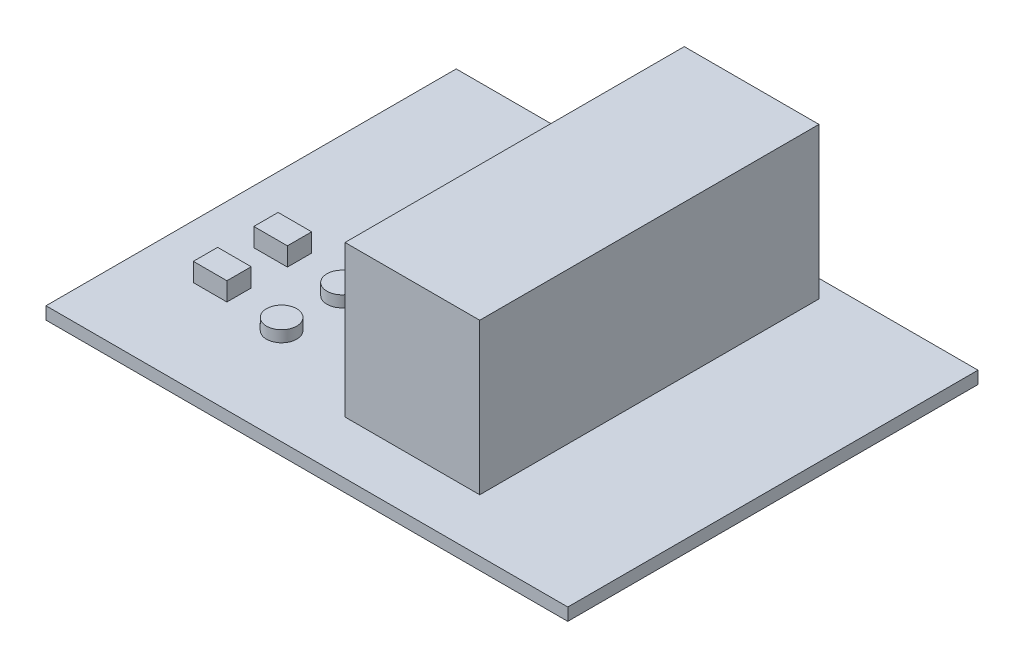
ISO-10303-21;
HEADER;
FILE_DESCRIPTION(('STEP AP214'),'2;1');
FILE_NAME('part.step','',(''),(''),'','','');
FILE_SCHEMA(('AUTOMOTIVE_DESIGN { 1 0 10303 214 1 1 1 1 }'));
ENDSEC;
DATA;
#1=APPLICATION_CONTEXT('core data for automotive mechanical design processes');
#2=APPLICATION_PROTOCOL_DEFINITION('international standard','automotive_design',2000,#1);
#3=PRODUCT_CONTEXT('',#1,'mechanical');
#4=PRODUCT('Part','Part','',(#3));
#5=PRODUCT_RELATED_PRODUCT_CATEGORY('part','',(#4));
#6=PRODUCT_DEFINITION_FORMATION('','',#4);
#7=PRODUCT_DEFINITION_CONTEXT('part definition',#1,'design');
#8=PRODUCT_DEFINITION('design','',#6,#7);
#9=PRODUCT_DEFINITION_SHAPE('','',#8);
#10=(LENGTH_UNIT() NAMED_UNIT(*) SI_UNIT(.MILLI.,.METRE.));
#11=(NAMED_UNIT(*) PLANE_ANGLE_UNIT() SI_UNIT($,.RADIAN.));
#12=(NAMED_UNIT(*) SI_UNIT($,.STERADIAN.) SOLID_ANGLE_UNIT());
#13=UNCERTAINTY_MEASURE_WITH_UNIT(LENGTH_MEASURE(1.E-05),#10,'distance_accuracy_value','');
#14=(GEOMETRIC_REPRESENTATION_CONTEXT(3) GLOBAL_UNCERTAINTY_ASSIGNED_CONTEXT((#13)) GLOBAL_UNIT_ASSIGNED_CONTEXT((#10,
#11,#12)) REPRESENTATION_CONTEXT('',''));
#15=CARTESIAN_POINT('',(0.,0.,0.));
#16=DIRECTION('',(0.,0.,1.));
#17=DIRECTION('',(1.,0.,0.));
#18=AXIS2_PLACEMENT_3D('',#15,#16,#17);
#19=CARTESIAN_POINT('',(0.,1.65,0.));
#20=DIRECTION('',(0.,-1.,0.));
#21=DIRECTION('',(0.,0.,-1.));
#22=AXIS2_PLACEMENT_3D('',#19,#20,#21);
#23=PLANE('',#22);
#24=DIRECTION('',(0.,0.,-1.));
#25=VECTOR('',#24,1.);
#26=CARTESIAN_POINT('',(-22.975,1.65,3.53));
#27=LINE('',#26,#25);
#28=CARTESIAN_POINT('',(-22.975,1.65,6.74));
#29=VERTEX_POINT('',#28);
#30=CARTESIAN_POINT('',(-22.975,1.65,3.53));
#31=VERTEX_POINT('',#30);
#32=EDGE_CURVE('E168',#29,#31,#27,.T.);
#33=ORIENTED_EDGE('',*,*,#32,.F.);
#34=DIRECTION('',(1.,0.,0.));
#35=VECTOR('',#34,1.);
#36=CARTESIAN_POINT('',(-27.415,1.65,6.74));
#37=LINE('',#36,#35);
#38=CARTESIAN_POINT('',(-27.415,1.65,6.74));
#39=VERTEX_POINT('',#38);
#40=EDGE_CURVE('E181',#39,#29,#37,.T.);
#41=ORIENTED_EDGE('',*,*,#40,.F.);
#42=DIRECTION('',(0.,0.,1.));
#43=VECTOR('',#42,1.);
#44=CARTESIAN_POINT('',(-27.415,1.65,3.53));
#45=LINE('',#44,#43);
#46=CARTESIAN_POINT('',(-27.415,1.65,3.53));
#47=VERTEX_POINT('',#46);
#48=EDGE_CURVE('E190',#47,#39,#45,.T.);
#49=ORIENTED_EDGE('',*,*,#48,.F.);
#50=DIRECTION('',(-1.,0.,0.));
#51=VECTOR('',#50,1.);
#52=CARTESIAN_POINT('',(-27.415,1.65,3.53));
#53=LINE('',#52,#51);
#54=EDGE_CURVE('E171',#31,#47,#53,.T.);
#55=ORIENTED_EDGE('',*,*,#54,.F.);
#56=EDGE_LOOP('',(#33,#41,#49,#55));
#57=FACE_BOUND('',#56,.T.);
#58=DIRECTION('',(0.,0.,-1.));
#59=VECTOR('',#58,1.);
#60=CARTESIAN_POINT('',(34.515,1.65,27.135));
#61=LINE('',#60,#59);
#62=CARTESIAN_POINT('',(34.515,1.65,27.135));
#63=VERTEX_POINT('',#62);
#64=CARTESIAN_POINT('',(34.515,1.65,-27.135));
#65=VERTEX_POINT('',#64);
#66=EDGE_CURVE('E246',#63,#65,#61,.T.);
#67=ORIENTED_EDGE('',*,*,#66,.T.);
#68=DIRECTION('',(-1.,0.,0.));
#69=VECTOR('',#68,1.);
#70=CARTESIAN_POINT('',(-34.515,1.65,-27.135));
#71=LINE('',#70,#69);
#72=CARTESIAN_POINT('',(-34.515,1.65,-27.135));
#73=VERTEX_POINT('',#72);
#74=EDGE_CURVE('E249',#65,#73,#71,.T.);
#75=ORIENTED_EDGE('',*,*,#74,.T.);
#76=DIRECTION('',(0.,0.,1.));
#77=VECTOR('',#76,1.);
#78=CARTESIAN_POINT('',(-34.515,1.65,27.135));
#79=LINE('',#78,#77);
#80=CARTESIAN_POINT('',(-34.515,1.65,27.135));
#81=VERTEX_POINT('',#80);
#82=EDGE_CURVE('E252',#73,#81,#79,.T.);
#83=ORIENTED_EDGE('',*,*,#82,.T.);
#84=DIRECTION('',(1.,0.,0.));
#85=VECTOR('',#84,1.);
#86=CARTESIAN_POINT('',(-34.515,1.65,27.135));
#87=LINE('',#86,#85);
#88=EDGE_CURVE('E254',#81,#63,#87,.T.);
#89=ORIENTED_EDGE('',*,*,#88,.T.);
#90=EDGE_LOOP('',(#67,#75,#83,#89));
#91=FACE_BOUND('',#90,.T.);
#92=CARTESIAN_POINT('',(-16.095,1.65,14.385));
#93=DIRECTION('',(0.,-1.,0.));
#94=DIRECTION('',(0.,0.,-1.));
#95=AXIS2_PLACEMENT_3D('',#92,#93,#94);
#96=CIRCLE('',#95,2.);
#97=CARTESIAN_POINT('',(-16.095,1.65,12.385));
#98=VERTEX_POINT('',#97);
#99=EDGE_CURVE('E42',#98,#98,#96,.F.);
#100=ORIENTED_EDGE('',*,*,#99,.F.);
#101=EDGE_LOOP('',(#100));
#102=FACE_BOUND('',#101,.T.);
#103=CARTESIAN_POINT('',(-16.095,1.65,6.385));
#104=DIRECTION('',(0.,-1.,0.));
#105=DIRECTION('',(0.,0.,-1.));
#106=AXIS2_PLACEMENT_3D('',#103,#104,#105);
#107=CIRCLE('',#106,2.);
#108=CARTESIAN_POINT('',(-16.095,1.65,4.385));
#109=VERTEX_POINT('',#108);
#110=EDGE_CURVE('E11',#109,#109,#107,.F.);
#111=ORIENTED_EDGE('',*,*,#110,.F.);
#112=EDGE_LOOP('',(#111));
#113=FACE_BOUND('',#112,.T.);
#114=DIRECTION('',(0.,0.,-1.));
#115=VECTOR('',#114,1.);
#116=CARTESIAN_POINT('',(-22.975,1.65,11.53));
#117=LINE('',#116,#115);
#118=CARTESIAN_POINT('',(-22.975,1.65,14.74));
#119=VERTEX_POINT('',#118);
#120=CARTESIAN_POINT('',(-22.975,1.65,11.53));
#121=VERTEX_POINT('',#120);
#122=EDGE_CURVE('E206',#119,#121,#117,.T.);
#123=ORIENTED_EDGE('',*,*,#122,.F.);
#124=DIRECTION('',(1.,0.,0.));
#125=VECTOR('',#124,1.);
#126=CARTESIAN_POINT('',(-27.415,1.65,14.74));
#127=LINE('',#126,#125);
#128=CARTESIAN_POINT('',(-27.415,1.65,14.74));
#129=VERTEX_POINT('',#128);
#130=EDGE_CURVE('E211',#129,#119,#127,.T.);
#131=ORIENTED_EDGE('',*,*,#130,.F.);
#132=DIRECTION('',(0.,0.,1.));
#133=VECTOR('',#132,1.);
#134=CARTESIAN_POINT('',(-27.415,1.65,11.53));
#135=LINE('',#134,#133);
#136=CARTESIAN_POINT('',(-27.415,1.65,11.53));
#137=VERTEX_POINT('',#136);
#138=EDGE_CURVE('E223',#137,#129,#135,.T.);
#139=ORIENTED_EDGE('',*,*,#138,.F.);
#140=DIRECTION('',(-1.,0.,0.));
#141=VECTOR('',#140,1.);
#142=CARTESIAN_POINT('',(-27.415,1.65,11.53));
#143=LINE('',#142,#141);
#144=EDGE_CURVE('E220',#121,#137,#143,.T.);
#145=ORIENTED_EDGE('',*,*,#144,.F.);
#146=EDGE_LOOP('',(#123,#131,#139,#145));
#147=FACE_BOUND('',#146,.T.);
#148=DIRECTION('',(0.,0.,1.));
#149=VECTOR('',#148,1.);
#150=CARTESIAN_POINT('',(-1.98499999999999,1.65,-24.775));
#151=LINE('',#150,#149);
#152=CARTESIAN_POINT('',(-1.98499999999999,1.65,-24.775));
#153=VERTEX_POINT('',#152);
#154=CARTESIAN_POINT('',(-1.98499999999999,1.65,20.105));
#155=VERTEX_POINT('',#154);
#156=EDGE_CURVE('E167',#153,#155,#151,.T.);
#157=ORIENTED_EDGE('',*,*,#156,.F.);
#158=DIRECTION('',(-1.,0.,0.));
#159=VECTOR('',#158,1.);
#160=CARTESIAN_POINT('',(-1.98499999999999,1.65,-24.775));
#161=LINE('',#160,#159);
#162=CARTESIAN_POINT('',(15.835,1.65,-24.775));
#163=VERTEX_POINT('',#162);
#164=EDGE_CURVE('E164',#163,#153,#161,.T.);
#165=ORIENTED_EDGE('',*,*,#164,.F.);
#166=DIRECTION('',(0.,0.,-1.));
#167=VECTOR('',#166,1.);
#168=CARTESIAN_POINT('',(15.835,1.65,-24.775));
#169=LINE('',#168,#167);
#170=CARTESIAN_POINT('',(15.835,1.65,20.105));
#171=VERTEX_POINT('',#170);
#172=EDGE_CURVE('E54',#171,#163,#169,.T.);
#173=ORIENTED_EDGE('',*,*,#172,.F.);
#174=DIRECTION('',(1.,0.,0.));
#175=VECTOR('',#174,1.);
#176=CARTESIAN_POINT('',(-1.98499999999999,1.65,20.105));
#177=LINE('',#176,#175);
#178=EDGE_CURVE('E49',#155,#171,#177,.T.);
#179=ORIENTED_EDGE('',*,*,#178,.F.);
#180=EDGE_LOOP('',(#157,#165,#173,#179));
#181=FACE_BOUND('',#180,.T.);
#182=ADVANCED_FACE('F34',(#57,#91,#102,#113,#147,#181),#23,.F.);
#183=CARTESIAN_POINT('',(34.515,1.65,27.135));
#184=DIRECTION('',(-1.,0.,0.));
#185=DIRECTION('',(0.,0.,1.));
#186=AXIS2_PLACEMENT_3D('',#183,#184,#185);
#187=PLANE('',#186);
#188=DIRECTION('',(0.,0.,-1.));
#189=VECTOR('',#188,1.);
#190=CARTESIAN_POINT('',(34.515,0.,27.135));
#191=LINE('',#190,#189);
#192=CARTESIAN_POINT('',(34.515,0.,27.135));
#193=VERTEX_POINT('',#192);
#194=CARTESIAN_POINT('',(34.515,0.,-27.135));
#195=VERTEX_POINT('',#194);
#196=EDGE_CURVE('E245',#193,#195,#191,.T.);
#197=ORIENTED_EDGE('',*,*,#196,.T.);
#198=DIRECTION('',(0.,-1.,0.));
#199=VECTOR('',#198,1.);
#200=CARTESIAN_POINT('',(34.515,1.65,-27.135));
#201=LINE('',#200,#199);
#202=EDGE_CURVE('E272',#65,#195,#201,.T.);
#203=ORIENTED_EDGE('',*,*,#202,.F.);
#204=ORIENTED_EDGE('',*,*,#66,.F.);
#205=DIRECTION('',(0.,-1.,0.));
#206=VECTOR('',#205,1.);
#207=CARTESIAN_POINT('',(34.515,1.65,27.135));
#208=LINE('',#207,#206);
#209=EDGE_CURVE('E256',#63,#193,#208,.T.);
#210=ORIENTED_EDGE('',*,*,#209,.T.);
#211=EDGE_LOOP('',(#197,#203,#204,#210));
#212=FACE_BOUND('',#211,.T.);
#213=ADVANCED_FACE('F36',(#212),#187,.F.);
#214=CARTESIAN_POINT('',(-34.515,1.65,-27.135));
#215=DIRECTION('',(0.,0.,1.));
#216=DIRECTION('',(1.,0.,0.));
#217=AXIS2_PLACEMENT_3D('',#214,#215,#216);
#218=PLANE('',#217);
#219=DIRECTION('',(-1.,0.,0.));
#220=VECTOR('',#219,1.);
#221=CARTESIAN_POINT('',(-34.515,0.,-27.135));
#222=LINE('',#221,#220);
#223=CARTESIAN_POINT('',(-34.515,0.,-27.135));
#224=VERTEX_POINT('',#223);
#225=EDGE_CURVE('E259',#195,#224,#222,.T.);
#226=ORIENTED_EDGE('',*,*,#225,.T.);
#227=DIRECTION('',(0.,-1.,0.));
#228=VECTOR('',#227,1.);
#229=CARTESIAN_POINT('',(-34.515,1.65,-27.135));
#230=LINE('',#229,#228);
#231=EDGE_CURVE('E269',#73,#224,#230,.T.);
#232=ORIENTED_EDGE('',*,*,#231,.F.);
#233=ORIENTED_EDGE('',*,*,#74,.F.);
#234=ORIENTED_EDGE('',*,*,#202,.T.);
#235=EDGE_LOOP('',(#226,#232,#233,#234));
#236=FACE_BOUND('',#235,.T.);
#237=ADVANCED_FACE('F377',(#236),#218,.F.);
#238=CARTESIAN_POINT('',(-34.515,1.65,27.135));
#239=DIRECTION('',(1.,0.,0.));
#240=DIRECTION('',(0.,0.,-1.));
#241=AXIS2_PLACEMENT_3D('',#238,#239,#240);
#242=PLANE('',#241);
#243=DIRECTION('',(0.,0.,1.));
#244=VECTOR('',#243,1.);
#245=CARTESIAN_POINT('',(-34.515,0.,27.135));
#246=LINE('',#245,#244);
#247=CARTESIAN_POINT('',(-34.515,0.,27.135));
#248=VERTEX_POINT('',#247);
#249=EDGE_CURVE('E261',#224,#248,#246,.T.);
#250=ORIENTED_EDGE('',*,*,#249,.T.);
#251=DIRECTION('',(0.,-1.,0.));
#252=VECTOR('',#251,1.);
#253=CARTESIAN_POINT('',(-34.515,1.65,27.135));
#254=LINE('',#253,#252);
#255=EDGE_CURVE('E266',#81,#248,#254,.T.);
#256=ORIENTED_EDGE('',*,*,#255,.F.);
#257=ORIENTED_EDGE('',*,*,#82,.F.);
#258=ORIENTED_EDGE('',*,*,#231,.T.);
#259=EDGE_LOOP('',(#250,#256,#257,#258));
#260=FACE_BOUND('',#259,.T.);
#261=ADVANCED_FACE('F374',(#260),#242,.F.);
#262=CARTESIAN_POINT('',(-34.515,1.65,27.135));
#263=DIRECTION('',(0.,0.,-1.));
#264=DIRECTION('',(-1.,0.,0.));
#265=AXIS2_PLACEMENT_3D('',#262,#263,#264);
#266=PLANE('',#265);
#267=DIRECTION('',(1.,0.,0.));
#268=VECTOR('',#267,1.);
#269=CARTESIAN_POINT('',(-34.515,0.,27.135));
#270=LINE('',#269,#268);
#271=EDGE_CURVE('E250',#248,#193,#270,.T.);
#272=ORIENTED_EDGE('',*,*,#271,.T.);
#273=ORIENTED_EDGE('',*,*,#209,.F.);
#274=ORIENTED_EDGE('',*,*,#88,.F.);
#275=ORIENTED_EDGE('',*,*,#255,.T.);
#276=EDGE_LOOP('',(#272,#273,#274,#275));
#277=FACE_BOUND('',#276,.T.);
#278=ADVANCED_FACE('F370',(#277),#266,.F.);
#279=CARTESIAN_POINT('',(0.,0.,0.));
#280=DIRECTION('',(0.,-1.,0.));
#281=DIRECTION('',(0.,0.,-1.));
#282=AXIS2_PLACEMENT_3D('',#279,#280,#281);
#283=PLANE('',#282);
#284=ORIENTED_EDGE('',*,*,#196,.F.);
#285=ORIENTED_EDGE('',*,*,#271,.F.);
#286=ORIENTED_EDGE('',*,*,#249,.F.);
#287=ORIENTED_EDGE('',*,*,#225,.F.);
#288=EDGE_LOOP('',(#284,#285,#286,#287));
#289=FACE_BOUND('',#288,.T.);
#290=ADVANCED_FACE('F365',(#289),#283,.T.);
#291=CARTESIAN_POINT('',(-16.095,3.15,14.385));
#292=DIRECTION('',(0.,-1.,0.));
#293=DIRECTION('',(0.,0.,-1.));
#294=AXIS2_PLACEMENT_3D('',#291,#292,#293);
#295=CYLINDRICAL_SURFACE('',#294,2.);
#296=CARTESIAN_POINT('',(-16.095,3.15,14.385));
#297=DIRECTION('',(0.,1.,0.));
#298=DIRECTION('',(0.,0.,1.));
#299=AXIS2_PLACEMENT_3D('',#296,#297,#298);
#300=CIRCLE('',#299,2.);
#301=CARTESIAN_POINT('',(-16.095,3.15,16.385));
#302=VERTEX_POINT('',#301);
#303=EDGE_CURVE('E242',#302,#302,#300,.T.);
#304=ORIENTED_EDGE('',*,*,#303,.F.);
#305=EDGE_LOOP('',(#304));
#306=FACE_BOUND('',#305,.T.);
#307=ORIENTED_EDGE('',*,*,#99,.T.);
#308=EDGE_LOOP('',(#307));
#309=FACE_BOUND('',#308,.T.);
#310=ADVANCED_FACE('F277',(#306,#309),#295,.T.);
#311=CARTESIAN_POINT('',(-16.095,3.15,14.385));
#312=DIRECTION('',(0.,1.,0.));
#313=DIRECTION('',(0.,0.,1.));
#314=AXIS2_PLACEMENT_3D('',#311,#312,#313);
#315=PLANE('',#314);
#316=ORIENTED_EDGE('',*,*,#303,.T.);
#317=EDGE_LOOP('',(#316));
#318=FACE_BOUND('',#317,.T.);
#319=ADVANCED_FACE('F359',(#318),#315,.T.);
#320=CARTESIAN_POINT('',(-16.095,3.15,6.385));
#321=DIRECTION('',(0.,-1.,0.));
#322=DIRECTION('',(0.,0.,-1.));
#323=AXIS2_PLACEMENT_3D('',#320,#321,#322);
#324=CYLINDRICAL_SURFACE('',#323,2.);
#325=CARTESIAN_POINT('',(-16.095,3.15,6.385));
#326=DIRECTION('',(0.,1.,0.));
#327=DIRECTION('',(0.,0.,1.));
#328=AXIS2_PLACEMENT_3D('',#325,#326,#327);
#329=CIRCLE('',#328,2.);
#330=CARTESIAN_POINT('',(-16.095,3.15,8.385));
#331=VERTEX_POINT('',#330);
#332=EDGE_CURVE('E239',#331,#331,#329,.T.);
#333=ORIENTED_EDGE('',*,*,#332,.F.);
#334=EDGE_LOOP('',(#333));
#335=FACE_BOUND('',#334,.T.);
#336=ORIENTED_EDGE('',*,*,#110,.T.);
#337=EDGE_LOOP('',(#336));
#338=FACE_BOUND('',#337,.T.);
#339=ADVANCED_FACE('F355',(#335,#338),#324,.T.);
#340=CARTESIAN_POINT('',(-16.095,3.15,6.385));
#341=DIRECTION('',(0.,1.,0.));
#342=DIRECTION('',(0.,0.,1.));
#343=AXIS2_PLACEMENT_3D('',#340,#341,#342);
#344=PLANE('',#343);
#345=ORIENTED_EDGE('',*,*,#332,.T.);
#346=EDGE_LOOP('',(#345));
#347=FACE_BOUND('',#346,.T.);
#348=ADVANCED_FACE('F351',(#347),#344,.T.);
#349=CARTESIAN_POINT('',(-22.975,4.09,11.53));
#350=DIRECTION('',(-1.,0.,0.));
#351=DIRECTION('',(0.,0.,1.));
#352=AXIS2_PLACEMENT_3D('',#349,#350,#351);
#353=PLANE('',#352);
#354=ORIENTED_EDGE('',*,*,#122,.T.);
#355=DIRECTION('',(0.,-1.,0.));
#356=VECTOR('',#355,1.);
#357=CARTESIAN_POINT('',(-22.975,4.09,11.53));
#358=LINE('',#357,#356);
#359=CARTESIAN_POINT('',(-22.975,4.09,11.53));
#360=VERTEX_POINT('',#359);
#361=EDGE_CURVE('E236',#360,#121,#358,.T.);
#362=ORIENTED_EDGE('',*,*,#361,.F.);
#363=DIRECTION('',(0.,0.,-1.));
#364=VECTOR('',#363,1.);
#365=CARTESIAN_POINT('',(-22.975,4.09,11.53));
#366=LINE('',#365,#364);
#367=CARTESIAN_POINT('',(-22.975,4.09,14.74));
#368=VERTEX_POINT('',#367);
#369=EDGE_CURVE('E207',#368,#360,#366,.T.);
#370=ORIENTED_EDGE('',*,*,#369,.F.);
#371=DIRECTION('',(0.,-1.,0.));
#372=VECTOR('',#371,1.);
#373=CARTESIAN_POINT('',(-22.975,4.09,14.74));
#374=LINE('',#373,#372);
#375=EDGE_CURVE('E217',#368,#119,#374,.T.);
#376=ORIENTED_EDGE('',*,*,#375,.T.);
#377=EDGE_LOOP('',(#354,#362,#370,#376));
#378=FACE_BOUND('',#377,.T.);
#379=ADVANCED_FACE('F347',(#378),#353,.F.);
#380=CARTESIAN_POINT('',(-27.415,4.09,11.53));
#381=DIRECTION('',(0.,0.,1.));
#382=DIRECTION('',(1.,0.,0.));
#383=AXIS2_PLACEMENT_3D('',#380,#381,#382);
#384=PLANE('',#383);
#385=ORIENTED_EDGE('',*,*,#144,.T.);
#386=DIRECTION('',(0.,-1.,0.));
#387=VECTOR('',#386,1.);
#388=CARTESIAN_POINT('',(-27.415,4.09,11.53));
#389=LINE('',#388,#387);
#390=CARTESIAN_POINT('',(-27.415,4.09,11.53));
#391=VERTEX_POINT('',#390);
#392=EDGE_CURVE('E233',#391,#137,#389,.T.);
#393=ORIENTED_EDGE('',*,*,#392,.F.);
#394=DIRECTION('',(-1.,0.,0.));
#395=VECTOR('',#394,1.);
#396=CARTESIAN_POINT('',(-27.415,4.09,11.53));
#397=LINE('',#396,#395);
#398=EDGE_CURVE('E210',#360,#391,#397,.T.);
#399=ORIENTED_EDGE('',*,*,#398,.F.);
#400=ORIENTED_EDGE('',*,*,#361,.T.);
#401=EDGE_LOOP('',(#385,#393,#399,#400));
#402=FACE_BOUND('',#401,.T.);
#403=ADVANCED_FACE('F343',(#402),#384,.F.);
#404=CARTESIAN_POINT('',(-27.415,4.09,11.53));
#405=DIRECTION('',(1.,0.,0.));
#406=DIRECTION('',(0.,0.,-1.));
#407=AXIS2_PLACEMENT_3D('',#404,#405,#406);
#408=PLANE('',#407);
#409=ORIENTED_EDGE('',*,*,#138,.T.);
#410=DIRECTION('',(0.,-1.,0.));
#411=VECTOR('',#410,1.);
#412=CARTESIAN_POINT('',(-27.415,4.09,14.74));
#413=LINE('',#412,#411);
#414=CARTESIAN_POINT('',(-27.415,4.09,14.74));
#415=VERTEX_POINT('',#414);
#416=EDGE_CURVE('E230',#415,#129,#413,.T.);
#417=ORIENTED_EDGE('',*,*,#416,.F.);
#418=DIRECTION('',(0.,0.,1.));
#419=VECTOR('',#418,1.);
#420=CARTESIAN_POINT('',(-27.415,4.09,11.53));
#421=LINE('',#420,#419);
#422=EDGE_CURVE('E213',#391,#415,#421,.T.);
#423=ORIENTED_EDGE('',*,*,#422,.F.);
#424=ORIENTED_EDGE('',*,*,#392,.T.);
#425=EDGE_LOOP('',(#409,#417,#423,#424));
#426=FACE_BOUND('',#425,.T.);
#427=ADVANCED_FACE('F339',(#426),#408,.F.);
#428=CARTESIAN_POINT('',(-27.415,4.09,14.74));
#429=DIRECTION('',(0.,0.,-1.));
#430=DIRECTION('',(-1.,0.,0.));
#431=AXIS2_PLACEMENT_3D('',#428,#429,#430);
#432=PLANE('',#431);
#433=ORIENTED_EDGE('',*,*,#130,.T.);
#434=ORIENTED_EDGE('',*,*,#375,.F.);
#435=DIRECTION('',(1.,0.,0.));
#436=VECTOR('',#435,1.);
#437=CARTESIAN_POINT('',(-27.415,4.09,14.74));
#438=LINE('',#437,#436);
#439=EDGE_CURVE('E215',#415,#368,#438,.T.);
#440=ORIENTED_EDGE('',*,*,#439,.F.);
#441=ORIENTED_EDGE('',*,*,#416,.T.);
#442=EDGE_LOOP('',(#433,#434,#440,#441));
#443=FACE_BOUND('',#442,.T.);
#444=ADVANCED_FACE('F335',(#443),#432,.F.);
#445=CARTESIAN_POINT('',(0.,4.09,0.));
#446=DIRECTION('',(0.,1.,0.));
#447=DIRECTION('',(0.,0.,1.));
#448=AXIS2_PLACEMENT_3D('',#445,#446,#447);
#449=PLANE('',#448);
#450=ORIENTED_EDGE('',*,*,#369,.T.);
#451=ORIENTED_EDGE('',*,*,#398,.T.);
#452=ORIENTED_EDGE('',*,*,#422,.T.);
#453=ORIENTED_EDGE('',*,*,#439,.T.);
#454=EDGE_LOOP('',(#450,#451,#452,#453));
#455=FACE_BOUND('',#454,.T.);
#456=ADVANCED_FACE('F331',(#455),#449,.T.);
#457=CARTESIAN_POINT('',(-22.975,4.09,3.53));
#458=DIRECTION('',(-1.,0.,0.));
#459=DIRECTION('',(0.,0.,1.));
#460=AXIS2_PLACEMENT_3D('',#457,#458,#459);
#461=PLANE('',#460);
#462=ORIENTED_EDGE('',*,*,#32,.T.);
#463=DIRECTION('',(0.,-1.,0.));
#464=VECTOR('',#463,1.);
#465=CARTESIAN_POINT('',(-22.975,4.09,3.53));
#466=LINE('',#465,#464);
#467=CARTESIAN_POINT('',(-22.975,4.09,3.53));
#468=VERTEX_POINT('',#467);
#469=EDGE_CURVE('E203',#468,#31,#466,.T.);
#470=ORIENTED_EDGE('',*,*,#469,.F.);
#471=DIRECTION('',(0.,0.,-1.));
#472=VECTOR('',#471,1.);
#473=CARTESIAN_POINT('',(-22.975,4.09,3.53));
#474=LINE('',#473,#472);
#475=CARTESIAN_POINT('',(-22.975,4.09,6.74));
#476=VERTEX_POINT('',#475);
#477=EDGE_CURVE('E177',#476,#468,#474,.T.);
#478=ORIENTED_EDGE('',*,*,#477,.F.);
#479=DIRECTION('',(0.,-1.,0.));
#480=VECTOR('',#479,1.);
#481=CARTESIAN_POINT('',(-22.975,4.09,6.74));
#482=LINE('',#481,#480);
#483=EDGE_CURVE('E186',#476,#29,#482,.T.);
#484=ORIENTED_EDGE('',*,*,#483,.T.);
#485=EDGE_LOOP('',(#462,#470,#478,#484));
#486=FACE_BOUND('',#485,.T.);
#487=ADVANCED_FACE('F327',(#486),#461,.F.);
#488=CARTESIAN_POINT('',(-27.415,4.09,3.53));
#489=DIRECTION('',(0.,0.,1.));
#490=DIRECTION('',(1.,0.,0.));
#491=AXIS2_PLACEMENT_3D('',#488,#489,#490);
#492=PLANE('',#491);
#493=ORIENTED_EDGE('',*,*,#54,.T.);
#494=DIRECTION('',(0.,-1.,0.));
#495=VECTOR('',#494,1.);
#496=CARTESIAN_POINT('',(-27.415,4.09,3.53));
#497=LINE('',#496,#495);
#498=CARTESIAN_POINT('',(-27.415,4.09,3.53));
#499=VERTEX_POINT('',#498);
#500=EDGE_CURVE('E200',#499,#47,#497,.T.);
#501=ORIENTED_EDGE('',*,*,#500,.F.);
#502=DIRECTION('',(-1.,0.,0.));
#503=VECTOR('',#502,1.);
#504=CARTESIAN_POINT('',(-27.415,4.09,3.53));
#505=LINE('',#504,#503);
#506=EDGE_CURVE('E180',#468,#499,#505,.T.);
#507=ORIENTED_EDGE('',*,*,#506,.F.);
#508=ORIENTED_EDGE('',*,*,#469,.T.);
#509=EDGE_LOOP('',(#493,#501,#507,#508));
#510=FACE_BOUND('',#509,.T.);
#511=ADVANCED_FACE('F323',(#510),#492,.F.);
#512=CARTESIAN_POINT('',(-27.415,4.09,3.53));
#513=DIRECTION('',(1.,0.,0.));
#514=DIRECTION('',(0.,0.,-1.));
#515=AXIS2_PLACEMENT_3D('',#512,#513,#514);
#516=PLANE('',#515);
#517=ORIENTED_EDGE('',*,*,#48,.T.);
#518=DIRECTION('',(0.,-1.,0.));
#519=VECTOR('',#518,1.);
#520=CARTESIAN_POINT('',(-27.415,4.09,6.74));
#521=LINE('',#520,#519);
#522=CARTESIAN_POINT('',(-27.415,4.09,6.74));
#523=VERTEX_POINT('',#522);
#524=EDGE_CURVE('E197',#523,#39,#521,.T.);
#525=ORIENTED_EDGE('',*,*,#524,.F.);
#526=DIRECTION('',(0.,0.,1.));
#527=VECTOR('',#526,1.);
#528=CARTESIAN_POINT('',(-27.415,4.09,3.53));
#529=LINE('',#528,#527);
#530=EDGE_CURVE('E183',#499,#523,#529,.T.);
#531=ORIENTED_EDGE('',*,*,#530,.F.);
#532=ORIENTED_EDGE('',*,*,#500,.T.);
#533=EDGE_LOOP('',(#517,#525,#531,#532));
#534=FACE_BOUND('',#533,.T.);
#535=ADVANCED_FACE('F319',(#534),#516,.F.);
#536=CARTESIAN_POINT('',(-27.415,4.09,6.74));
#537=DIRECTION('',(0.,0.,-1.));
#538=DIRECTION('',(-1.,0.,0.));
#539=AXIS2_PLACEMENT_3D('',#536,#537,#538);
#540=PLANE('',#539);
#541=ORIENTED_EDGE('',*,*,#40,.T.);
#542=ORIENTED_EDGE('',*,*,#483,.F.);
#543=DIRECTION('',(1.,0.,0.));
#544=VECTOR('',#543,1.);
#545=CARTESIAN_POINT('',(-27.415,4.09,6.74));
#546=LINE('',#545,#544);
#547=EDGE_CURVE('E185',#523,#476,#546,.T.);
#548=ORIENTED_EDGE('',*,*,#547,.F.);
#549=ORIENTED_EDGE('',*,*,#524,.T.);
#550=EDGE_LOOP('',(#541,#542,#548,#549));
#551=FACE_BOUND('',#550,.T.);
#552=ADVANCED_FACE('F315',(#551),#540,.F.);
#553=CARTESIAN_POINT('',(0.,4.09,0.));
#554=DIRECTION('',(0.,1.,0.));
#555=DIRECTION('',(0.,0.,1.));
#556=AXIS2_PLACEMENT_3D('',#553,#554,#555);
#557=PLANE('',#556);
#558=ORIENTED_EDGE('',*,*,#477,.T.);
#559=ORIENTED_EDGE('',*,*,#506,.T.);
#560=ORIENTED_EDGE('',*,*,#530,.T.);
#561=ORIENTED_EDGE('',*,*,#547,.T.);
#562=EDGE_LOOP('',(#558,#559,#560,#561));
#563=FACE_BOUND('',#562,.T.);
#564=ADVANCED_FACE('F312',(#563),#557,.T.);
#565=CARTESIAN_POINT('',(-1.98499999999999,21.65,-24.775));
#566=DIRECTION('',(1.,0.,0.));
#567=DIRECTION('',(0.,0.,-1.));
#568=AXIS2_PLACEMENT_3D('',#565,#566,#567);
#569=PLANE('',#568);
#570=ORIENTED_EDGE('',*,*,#156,.T.);
#571=DIRECTION('',(0.,-1.,0.));
#572=VECTOR('',#571,1.);
#573=CARTESIAN_POINT('',(-1.98499999999999,21.65,20.105));
#574=LINE('',#573,#572);
#575=CARTESIAN_POINT('',(-1.98499999999999,21.65,20.105));
#576=VERTEX_POINT('',#575);
#577=EDGE_CURVE('E148',#576,#155,#574,.T.);
#578=ORIENTED_EDGE('',*,*,#577,.F.);
#579=DIRECTION('',(0.,0.,1.));
#580=VECTOR('',#579,1.);
#581=CARTESIAN_POINT('',(-1.98499999999999,21.65,-24.775));
#582=LINE('',#581,#580);
#583=CARTESIAN_POINT('',(-1.98499999999999,21.65,-24.775));
#584=VERTEX_POINT('',#583);
#585=EDGE_CURVE('E155',#584,#576,#582,.T.);
#586=ORIENTED_EDGE('',*,*,#585,.F.);
#587=DIRECTION('',(0.,-1.,0.));
#588=VECTOR('',#587,1.);
#589=CARTESIAN_POINT('',(-1.98499999999999,21.65,-24.775));
#590=LINE('',#589,#588);
#591=EDGE_CURVE('E290',#584,#153,#590,.T.);
#592=ORIENTED_EDGE('',*,*,#591,.T.);
#593=EDGE_LOOP('',(#570,#578,#586,#592));
#594=FACE_BOUND('',#593,.T.);
#595=ADVANCED_FACE('F166',(#594),#569,.F.);
#596=CARTESIAN_POINT('',(-1.98499999999999,21.65,20.105));
#597=DIRECTION('',(0.,0.,-1.));
#598=DIRECTION('',(-1.,0.,0.));
#599=AXIS2_PLACEMENT_3D('',#596,#597,#598);
#600=PLANE('',#599);
#601=ORIENTED_EDGE('',*,*,#178,.T.);
#602=DIRECTION('',(0.,-1.,0.));
#603=VECTOR('',#602,1.);
#604=CARTESIAN_POINT('',(15.835,21.65,20.105));
#605=LINE('',#604,#603);
#606=CARTESIAN_POINT('',(15.835,21.65,20.105));
#607=VERTEX_POINT('',#606);
#608=EDGE_CURVE('E151',#607,#171,#605,.T.);
#609=ORIENTED_EDGE('',*,*,#608,.F.);
#610=DIRECTION('',(1.,0.,0.));
#611=VECTOR('',#610,1.);
#612=CARTESIAN_POINT('',(-1.98499999999999,21.65,20.105));
#613=LINE('',#612,#611);
#614=EDGE_CURVE('E144',#576,#607,#613,.T.);
#615=ORIENTED_EDGE('',*,*,#614,.F.);
#616=ORIENTED_EDGE('',*,*,#577,.T.);
#617=EDGE_LOOP('',(#601,#609,#615,#616));
#618=FACE_BOUND('',#617,.T.);
#619=ADVANCED_FACE('F146',(#618),#600,.F.);
#620=CARTESIAN_POINT('',(15.835,21.65,-24.775));
#621=DIRECTION('',(-1.,0.,0.));
#622=DIRECTION('',(0.,0.,1.));
#623=AXIS2_PLACEMENT_3D('',#620,#621,#622);
#624=PLANE('',#623);
#625=ORIENTED_EDGE('',*,*,#172,.T.);
#626=DIRECTION('',(0.,-1.,0.));
#627=VECTOR('',#626,1.);
#628=CARTESIAN_POINT('',(15.835,21.65,-24.775));
#629=LINE('',#628,#627);
#630=CARTESIAN_POINT('',(15.835,21.65,-24.775));
#631=VERTEX_POINT('',#630);
#632=EDGE_CURVE('E173',#631,#163,#629,.T.);
#633=ORIENTED_EDGE('',*,*,#632,.F.);
#634=DIRECTION('',(0.,0.,-1.));
#635=VECTOR('',#634,1.);
#636=CARTESIAN_POINT('',(15.835,21.65,-24.775));
#637=LINE('',#636,#635);
#638=EDGE_CURVE('E154',#607,#631,#637,.T.);
#639=ORIENTED_EDGE('',*,*,#638,.F.);
#640=ORIENTED_EDGE('',*,*,#608,.T.);
#641=EDGE_LOOP('',(#625,#633,#639,#640));
#642=FACE_BOUND('',#641,.T.);
#643=ADVANCED_FACE('F299',(#642),#624,.F.);
#644=CARTESIAN_POINT('',(-1.98499999999999,21.65,-24.775));
#645=DIRECTION('',(0.,0.,1.));
#646=DIRECTION('',(1.,0.,0.));
#647=AXIS2_PLACEMENT_3D('',#644,#645,#646);
#648=PLANE('',#647);
#649=ORIENTED_EDGE('',*,*,#164,.T.);
#650=ORIENTED_EDGE('',*,*,#591,.F.);
#651=DIRECTION('',(-1.,0.,0.));
#652=VECTOR('',#651,1.);
#653=CARTESIAN_POINT('',(-1.98499999999999,21.65,-24.775));
#654=LINE('',#653,#652);
#655=EDGE_CURVE('E160',#631,#584,#654,.T.);
#656=ORIENTED_EDGE('',*,*,#655,.F.);
#657=ORIENTED_EDGE('',*,*,#632,.T.);
#658=EDGE_LOOP('',(#649,#650,#656,#657));
#659=FACE_BOUND('',#658,.T.);
#660=ADVANCED_FACE('F289',(#659),#648,.F.);
#661=CARTESIAN_POINT('',(0.,21.65,0.));
#662=DIRECTION('',(0.,1.,0.));
#663=DIRECTION('',(0.,0.,1.));
#664=AXIS2_PLACEMENT_3D('',#661,#662,#663);
#665=PLANE('',#664);
#666=ORIENTED_EDGE('',*,*,#585,.T.);
#667=ORIENTED_EDGE('',*,*,#614,.T.);
#668=ORIENTED_EDGE('',*,*,#638,.T.);
#669=ORIENTED_EDGE('',*,*,#655,.T.);
#670=EDGE_LOOP('',(#666,#667,#668,#669));
#671=FACE_BOUND('',#670,.T.);
#672=ADVANCED_FACE('F158',(#671),#665,.T.);
#673=CLOSED_SHELL('',(#182,#213,#237,#261,#278,#290,#310,#319,#339,#348,#379,#403,#427,#444,
#456,#487,#511,#535,#552,#564,#595,#619,#643,#660,#672));
#674=MANIFOLD_SOLID_BREP('B2',#673);
#675=ADVANCED_BREP_SHAPE_REPRESENTATION('',(#18,#674),#14);
#676=SHAPE_DEFINITION_REPRESENTATION(#9,#675);
ENDSEC;
END-ISO-10303-21;
